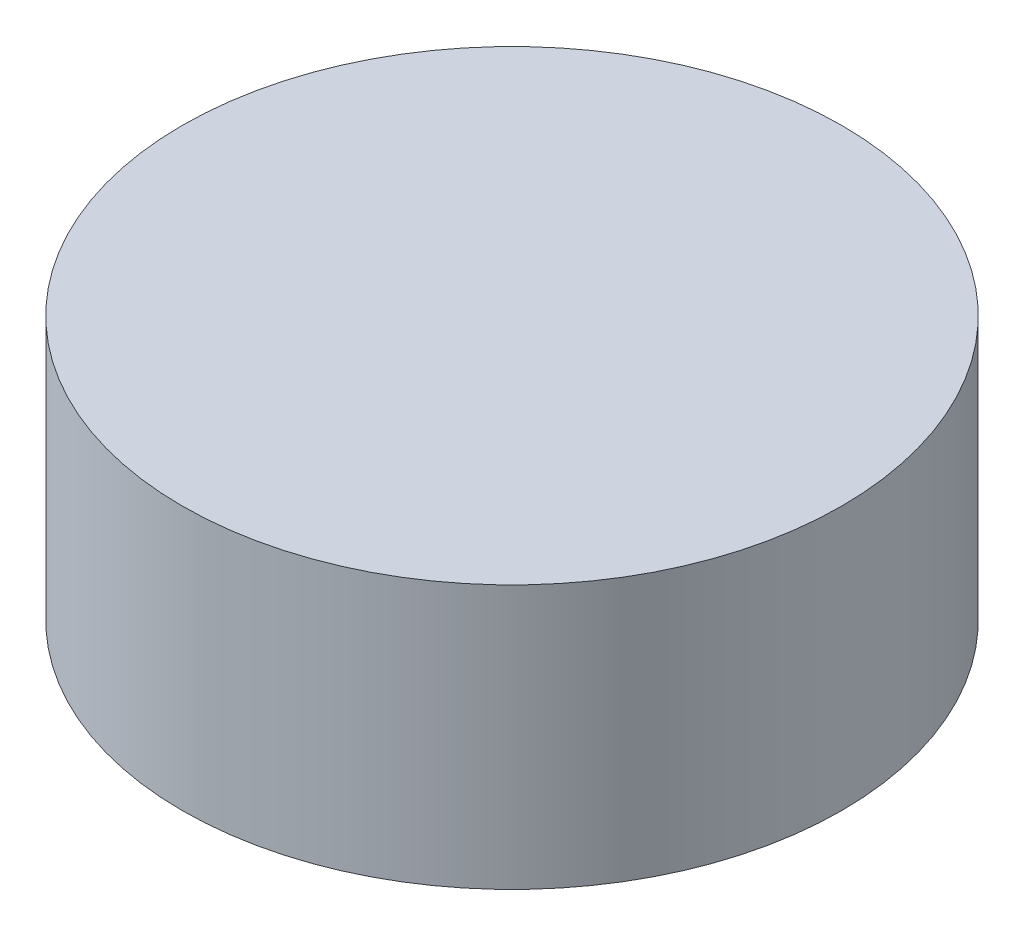
ISO-10303-21;
HEADER;
FILE_DESCRIPTION(('STEP AP214'),'2;1');
FILE_NAME('part.step','',(''),(''),'','','');
FILE_SCHEMA(('AUTOMOTIVE_DESIGN { 1 0 10303 214 1 1 1 1 }'));
ENDSEC;
DATA;
#1=APPLICATION_CONTEXT('core data for automotive mechanical design processes');
#2=APPLICATION_PROTOCOL_DEFINITION('international standard','automotive_design',2000,#1);
#3=PRODUCT_CONTEXT('',#1,'mechanical');
#4=PRODUCT('Part','Part','',(#3));
#5=PRODUCT_RELATED_PRODUCT_CATEGORY('part','',(#4));
#6=PRODUCT_DEFINITION_FORMATION('','',#4);
#7=PRODUCT_DEFINITION_CONTEXT('part definition',#1,'design');
#8=PRODUCT_DEFINITION('design','',#6,#7);
#9=PRODUCT_DEFINITION_SHAPE('','',#8);
#10=(LENGTH_UNIT() NAMED_UNIT(*) SI_UNIT(.MILLI.,.METRE.));
#11=(NAMED_UNIT(*) PLANE_ANGLE_UNIT() SI_UNIT($,.RADIAN.));
#12=(NAMED_UNIT(*) SI_UNIT($,.STERADIAN.) SOLID_ANGLE_UNIT());
#13=UNCERTAINTY_MEASURE_WITH_UNIT(LENGTH_MEASURE(1.E-05),#10,'distance_accuracy_value','');
#14=(GEOMETRIC_REPRESENTATION_CONTEXT(3) GLOBAL_UNCERTAINTY_ASSIGNED_CONTEXT((#13)) GLOBAL_UNIT_ASSIGNED_CONTEXT((#10,
#11,#12)) REPRESENTATION_CONTEXT('',''));
#15=CARTESIAN_POINT('',(0.,0.,0.));
#16=DIRECTION('',(0.,0.,1.));
#17=DIRECTION('',(1.,0.,0.));
#18=AXIS2_PLACEMENT_3D('',#15,#16,#17);
#19=CARTESIAN_POINT('',(0.,3.175,0.));
#20=DIRECTION('',(0.,-1.,0.));
#21=DIRECTION('',(0.,0.,-1.));
#22=AXIS2_PLACEMENT_3D('',#19,#20,#21);
#23=CYLINDRICAL_SURFACE('',#22,3.96875);
#24=CARTESIAN_POINT('',(0.,3.175,0.));
#25=DIRECTION('',(0.,1.,0.));
#26=DIRECTION('',(0.,0.,1.));
#27=AXIS2_PLACEMENT_3D('',#24,#25,#26);
#28=CIRCLE('',#27,3.96875);
#29=CARTESIAN_POINT('',(0.,3.175,3.96875));
#30=VERTEX_POINT('',#29);
#31=EDGE_CURVE('E10',#30,#30,#28,.T.);
#32=ORIENTED_EDGE('',*,*,#31,.F.);
#33=EDGE_LOOP('',(#32));
#34=FACE_BOUND('',#33,.T.);
#35=CARTESIAN_POINT('',(0.,0.,0.));
#36=DIRECTION('',(0.,1.,0.));
#37=DIRECTION('',(0.,0.,1.));
#38=AXIS2_PLACEMENT_3D('',#35,#36,#37);
#39=CIRCLE('',#38,3.96875);
#40=CARTESIAN_POINT('',(0.,0.,3.96875));
#41=VERTEX_POINT('',#40);
#42=EDGE_CURVE('E35',#41,#41,#39,.T.);
#43=ORIENTED_EDGE('',*,*,#42,.T.);
#44=EDGE_LOOP('',(#43));
#45=FACE_BOUND('',#44,.T.);
#46=ADVANCED_FACE('F32',(#34,#45),#23,.T.);
#47=CARTESIAN_POINT('',(0.,3.175,0.));
#48=DIRECTION('',(0.,1.,0.));
#49=DIRECTION('',(0.,0.,1.));
#50=AXIS2_PLACEMENT_3D('',#47,#48,#49);
#51=PLANE('',#50);
#52=ORIENTED_EDGE('',*,*,#31,.T.);
#53=EDGE_LOOP('',(#52));
#54=FACE_BOUND('',#53,.T.);
#55=ADVANCED_FACE('F47',(#54),#51,.T.);
#56=CARTESIAN_POINT('',(0.,0.,0.));
#57=DIRECTION('',(0.,1.,0.));
#58=DIRECTION('',(0.,0.,1.));
#59=AXIS2_PLACEMENT_3D('',#56,#57,#58);
#60=PLANE('',#59);
#61=ORIENTED_EDGE('',*,*,#42,.F.);
#62=EDGE_LOOP('',(#61));
#63=FACE_BOUND('',#62,.T.);
#64=ADVANCED_FACE('F45',(#63),#60,.F.);
#65=CLOSED_SHELL('',(#46,#55,#64));
#66=MANIFOLD_SOLID_BREP('B2',#65);
#67=ADVANCED_BREP_SHAPE_REPRESENTATION('',(#18,#66),#14);
#68=SHAPE_DEFINITION_REPRESENTATION(#9,#67);
ENDSEC;
END-ISO-10303-21;
